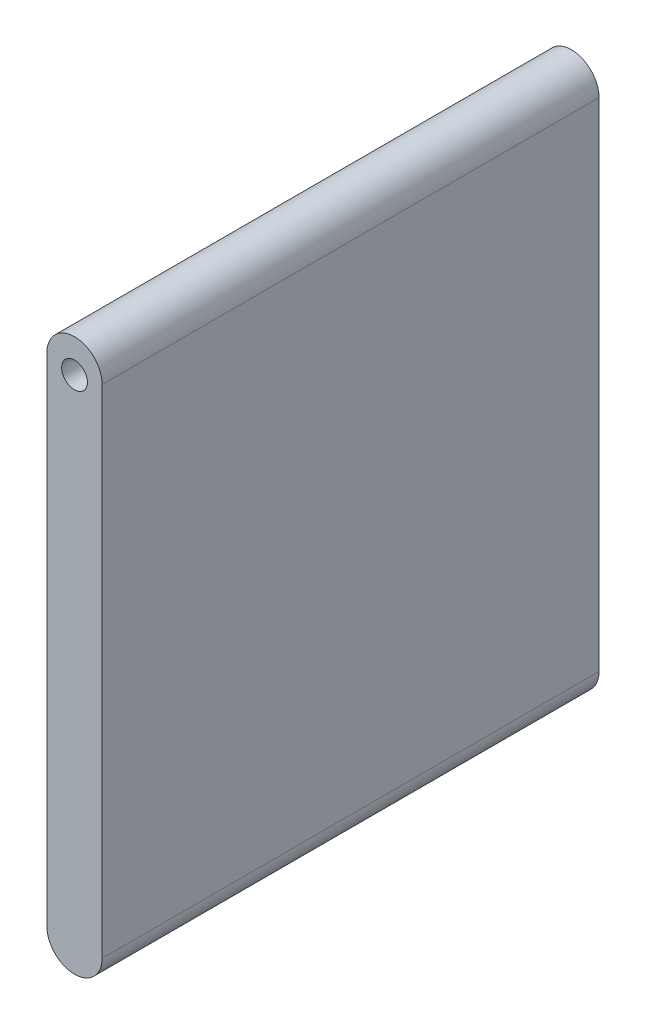
ISO-10303-21;
HEADER;
FILE_DESCRIPTION(('STEP AP214'),'2;1');
FILE_NAME('part.step','',(''),(''),'','','');
FILE_SCHEMA(('AUTOMOTIVE_DESIGN { 1 0 10303 214 1 1 1 1 }'));
ENDSEC;
DATA;
#1=APPLICATION_CONTEXT('core data for automotive mechanical design processes');
#2=APPLICATION_PROTOCOL_DEFINITION('international standard','automotive_design',2000,#1);
#3=PRODUCT_CONTEXT('',#1,'mechanical');
#4=PRODUCT('Part','Part','',(#3));
#5=PRODUCT_RELATED_PRODUCT_CATEGORY('part','',(#4));
#6=PRODUCT_DEFINITION_FORMATION('','',#4);
#7=PRODUCT_DEFINITION_CONTEXT('part definition',#1,'design');
#8=PRODUCT_DEFINITION('design','',#6,#7);
#9=PRODUCT_DEFINITION_SHAPE('','',#8);
#10=(LENGTH_UNIT() NAMED_UNIT(*) SI_UNIT(.MILLI.,.METRE.));
#11=(NAMED_UNIT(*) PLANE_ANGLE_UNIT() SI_UNIT($,.RADIAN.));
#12=(NAMED_UNIT(*) SI_UNIT($,.STERADIAN.) SOLID_ANGLE_UNIT());
#13=UNCERTAINTY_MEASURE_WITH_UNIT(LENGTH_MEASURE(1.E-05),#10,'distance_accuracy_value','');
#14=(GEOMETRIC_REPRESENTATION_CONTEXT(3) GLOBAL_UNCERTAINTY_ASSIGNED_CONTEXT((#13)) GLOBAL_UNIT_ASSIGNED_CONTEXT((#10,
#11,#12)) REPRESENTATION_CONTEXT('',''));
#15=CARTESIAN_POINT('',(0.,0.,0.));
#16=DIRECTION('',(0.,0.,1.));
#17=DIRECTION('',(1.,0.,0.));
#18=AXIS2_PLACEMENT_3D('',#15,#16,#17);
#19=CARTESIAN_POINT('',(-4.4030818648567,46.7518362911079,15.));
#20=DIRECTION('',(-1.,0.,0.));
#21=DIRECTION('',(0.,-1.,0.));
#22=AXIS2_PLACEMENT_3D('',#19,#20,#21);
#23=PLANE('',#22);
#24=DIRECTION('',(0.,1.,0.));
#25=VECTOR('',#24,1.);
#26=CARTESIAN_POINT('',(-4.4030818648567,46.7518362911079,125.));
#27=LINE('',#26,#25);
#28=CARTESIAN_POINT('',(-4.40308186485671,-66.2381994450933,125.));
#29=VERTEX_POINT('',#28);
#30=CARTESIAN_POINT('',(-4.4030818648567,46.7518362911079,125.));
#31=VERTEX_POINT('',#30);
#32=EDGE_CURVE('E187',#29,#31,#27,.T.);
#33=ORIENTED_EDGE('',*,*,#32,.F.);
#34=DIRECTION('',(0.,0.,1.));
#35=VECTOR('',#34,1.);
#36=CARTESIAN_POINT('',(-4.40308186485671,-66.2381994450933,15.));
#37=LINE('',#36,#35);
#38=CARTESIAN_POINT('',(-4.40308186485671,-66.2381994450933,40.));
#39=VERTEX_POINT('',#38);
#40=EDGE_CURVE('E175',#39,#29,#37,.T.);
#41=ORIENTED_EDGE('',*,*,#40,.F.);
#42=DIRECTION('',(0.,1.,0.));
#43=VECTOR('',#42,1.);
#44=CARTESIAN_POINT('',(-4.40308186485671,0.,40.));
#45=LINE('',#44,#43);
#46=CARTESIAN_POINT('',(-4.40308186485671,-30.5781994450934,40.));
#47=VERTEX_POINT('',#46);
#48=EDGE_CURVE('E375',#39,#47,#45,.T.);
#49=ORIENTED_EDGE('',*,*,#48,.T.);
#50=DIRECTION('',(0.,0.,1.));
#51=VECTOR('',#50,1.);
#52=CARTESIAN_POINT('',(-4.40308186485671,-30.5781994450934,40.));
#53=LINE('',#52,#51);
#54=CARTESIAN_POINT('',(-4.40308186485672,-30.5781994450934,15.));
#55=VERTEX_POINT('',#54);
#56=EDGE_CURVE('E219',#55,#47,#53,.T.);
#57=ORIENTED_EDGE('',*,*,#56,.F.);
#58=DIRECTION('',(0.,-1.,0.));
#59=VECTOR('',#58,1.);
#60=CARTESIAN_POINT('',(-4.40308186485671,-46.7518362911079,15.));
#61=LINE('',#60,#59);
#62=CARTESIAN_POINT('',(-4.4030818648567,46.7518362911079,15.));
#63=VERTEX_POINT('',#62);
#64=EDGE_CURVE('E191',#63,#55,#61,.T.);
#65=ORIENTED_EDGE('',*,*,#64,.F.);
#66=DIRECTION('',(0.,0.,1.));
#67=VECTOR('',#66,1.);
#68=CARTESIAN_POINT('',(-4.4030818648567,46.7518362911079,15.));
#69=LINE('',#68,#67);
#70=EDGE_CURVE('E188',#63,#31,#69,.T.);
#71=ORIENTED_EDGE('',*,*,#70,.T.);
#72=EDGE_LOOP('',(#33,#41,#49,#57,#65,#71));
#73=FACE_BOUND('',#72,.T.);
#74=ADVANCED_FACE('F47',(#73),#23,.F.);
#75=CARTESIAN_POINT('',(4.4030818648567,46.7518362911079,15.));
#76=DIRECTION('',(1.,0.,0.));
#77=DIRECTION('',(0.,1.,0.));
#78=AXIS2_PLACEMENT_3D('',#75,#76,#77);
#79=PLANE('',#78);
#80=DIRECTION('',(0.,-1.,0.));
#81=VECTOR('',#80,1.);
#82=CARTESIAN_POINT('',(4.4030818648567,46.7518362911079,125.));
#83=LINE('',#82,#81);
#84=CARTESIAN_POINT('',(4.4030818648567,46.7518362911079,125.));
#85=VERTEX_POINT('',#84);
#86=CARTESIAN_POINT('',(4.40308186485671,-66.2381994450933,125.));
#87=VERTEX_POINT('',#86);
#88=EDGE_CURVE('E63',#85,#87,#83,.T.);
#89=ORIENTED_EDGE('',*,*,#88,.F.);
#90=DIRECTION('',(0.,0.,1.));
#91=VECTOR('',#90,1.);
#92=CARTESIAN_POINT('',(4.4030818648567,46.7518362911079,15.));
#93=LINE('',#92,#91);
#94=CARTESIAN_POINT('',(4.4030818648567,46.7518362911079,15.));
#95=VERTEX_POINT('',#94);
#96=EDGE_CURVE('E211',#95,#85,#93,.T.);
#97=ORIENTED_EDGE('',*,*,#96,.F.);
#98=DIRECTION('',(0.,1.,0.));
#99=VECTOR('',#98,1.);
#100=CARTESIAN_POINT('',(4.40308186485671,-46.7518362911079,15.));
#101=LINE('',#100,#99);
#102=CARTESIAN_POINT('',(4.40308186485672,-30.5781994450934,15.));
#103=VERTEX_POINT('',#102);
#104=EDGE_CURVE('E202',#103,#95,#101,.T.);
#105=ORIENTED_EDGE('',*,*,#104,.F.);
#106=DIRECTION('',(0.,0.,-1.));
#107=VECTOR('',#106,1.);
#108=CARTESIAN_POINT('',(4.40308186485671,-30.5781994450934,40.));
#109=LINE('',#108,#107);
#110=CARTESIAN_POINT('',(4.40308186485671,-30.5781994450934,40.));
#111=VERTEX_POINT('',#110);
#112=EDGE_CURVE('E210',#111,#103,#109,.T.);
#113=ORIENTED_EDGE('',*,*,#112,.F.);
#114=DIRECTION('',(0.,-1.,0.));
#115=VECTOR('',#114,1.);
#116=CARTESIAN_POINT('',(4.40308186485671,0.,40.));
#117=LINE('',#116,#115);
#118=CARTESIAN_POINT('',(4.40308186485671,-66.2381994450933,40.));
#119=VERTEX_POINT('',#118);
#120=EDGE_CURVE('E371',#111,#119,#117,.T.);
#121=ORIENTED_EDGE('',*,*,#120,.T.);
#122=DIRECTION('',(0.,0.,1.));
#123=VECTOR('',#122,1.);
#124=CARTESIAN_POINT('',(4.40308186485671,-66.2381994450933,15.));
#125=LINE('',#124,#123);
#126=EDGE_CURVE('E183',#119,#87,#125,.T.);
#127=ORIENTED_EDGE('',*,*,#126,.T.);
#128=EDGE_LOOP('',(#89,#97,#105,#113,#121,#127));
#129=FACE_BOUND('',#128,.T.);
#130=ADVANCED_FACE('F383',(#129),#79,.F.);
#131=CARTESIAN_POINT('',(4.4030818648567,46.7518362911079,15.));
#132=DIRECTION('',(0.,1.,0.));
#133=DIRECTION('',(0.,0.,1.));
#134=AXIS2_PLACEMENT_3D('',#131,#132,#133);
#135=PLANE('',#134);
#136=DIRECTION('',(1.,0.,0.));
#137=VECTOR('',#136,1.);
#138=CARTESIAN_POINT('',(-4.5969181351433,46.7518362911079,125.));
#139=LINE('',#138,#137);
#140=EDGE_CURVE('E70',#31,#85,#139,.T.);
#141=ORIENTED_EDGE('',*,*,#140,.F.);
#142=ORIENTED_EDGE('',*,*,#70,.F.);
#143=DIRECTION('',(-1.,0.,0.));
#144=VECTOR('',#143,1.);
#145=CARTESIAN_POINT('',(4.4030818648567,46.7518362911079,15.));
#146=LINE('',#145,#144);
#147=EDGE_CURVE('E184',#95,#63,#146,.T.);
#148=ORIENTED_EDGE('',*,*,#147,.F.);
#149=ORIENTED_EDGE('',*,*,#96,.T.);
#150=EDGE_LOOP('',(#141,#142,#148,#149));
#151=FACE_BOUND('',#150,.T.);
#152=ADVANCED_FACE('F426',(#151),#135,.F.);
#153=CARTESIAN_POINT('',(-4.40308186485671,-66.2381994450933,15.));
#154=DIRECTION('',(0.,-1.,0.));
#155=DIRECTION('',(0.,0.,-1.));
#156=AXIS2_PLACEMENT_3D('',#153,#154,#155);
#157=PLANE('',#156);
#158=DIRECTION('',(-1.,0.,0.));
#159=VECTOR('',#158,1.);
#160=CARTESIAN_POINT('',(-4.40308186485671,-66.2381994450933,125.));
#161=LINE('',#160,#159);
#162=EDGE_CURVE('E11',#87,#29,#161,.T.);
#163=ORIENTED_EDGE('',*,*,#162,.F.);
#164=ORIENTED_EDGE('',*,*,#126,.F.);
#165=DIRECTION('',(-1.,0.,0.));
#166=VECTOR('',#165,1.);
#167=CARTESIAN_POINT('',(0.,-66.2381994450933,40.));
#168=LINE('',#167,#166);
#169=EDGE_CURVE('E179',#119,#39,#168,.T.);
#170=ORIENTED_EDGE('',*,*,#169,.T.);
#171=ORIENTED_EDGE('',*,*,#40,.T.);
#172=EDGE_LOOP('',(#163,#164,#170,#171));
#173=FACE_BOUND('',#172,.T.);
#174=ADVANCED_FACE('F177',(#173),#157,.F.);
#175=CARTESIAN_POINT('',(-7.40308186485673,56.2618005549066,135.));
#176=DIRECTION('',(1.,0.,0.));
#177=DIRECTION('',(0.,1.,0.));
#178=AXIS2_PLACEMENT_3D('',#175,#176,#177);
#179=PLANE('',#178);
#180=DIRECTION('',(0.,0.,1.));
#181=VECTOR('',#180,1.);
#182=CARTESIAN_POINT('',(-7.40308186485672,-57.9681292597429,95.));
#183=LINE('',#182,#181);
#184=CARTESIAN_POINT('',(-7.40308186485672,-57.9681292597429,40.));
#185=VERTEX_POINT('',#184);
#186=CARTESIAN_POINT('',(-7.40308186485672,-57.9681292597429,95.));
#187=VERTEX_POINT('',#186);
#188=EDGE_CURVE('E263',#185,#187,#183,.T.);
#189=ORIENTED_EDGE('',*,*,#188,.F.);
#190=DIRECTION('',(0.,-1.,0.));
#191=VECTOR('',#190,1.);
#192=CARTESIAN_POINT('',(-7.40308186485672,-57.9681292597429,40.));
#193=LINE('',#192,#191);
#194=CARTESIAN_POINT('',(-7.40308186485672,-41.5329864320166,40.));
#195=VERTEX_POINT('',#194);
#196=EDGE_CURVE('E260',#195,#185,#193,.T.);
#197=ORIENTED_EDGE('',*,*,#196,.F.);
#198=DIRECTION('',(0.,0.,-1.));
#199=VECTOR('',#198,1.);
#200=CARTESIAN_POINT('',(-7.40308186485672,-41.5329864320166,95.));
#201=LINE('',#200,#199);
#202=CARTESIAN_POINT('',(-7.40308186485672,-41.5329864320166,95.));
#203=VERTEX_POINT('',#202);
#204=EDGE_CURVE('E270',#203,#195,#201,.T.);
#205=ORIENTED_EDGE('',*,*,#204,.F.);
#206=DIRECTION('',(0.,1.,0.));
#207=VECTOR('',#206,1.);
#208=CARTESIAN_POINT('',(-7.40308186485672,-57.9681292597429,95.));
#209=LINE('',#208,#207);
#210=EDGE_CURVE('E267',#187,#203,#209,.T.);
#211=ORIENTED_EDGE('',*,*,#210,.F.);
#212=EDGE_LOOP('',(#189,#197,#205,#211));
#213=FACE_BOUND('',#212,.T.);
#214=DIRECTION('',(0.,-1.,0.));
#215=VECTOR('',#214,1.);
#216=CARTESIAN_POINT('',(-7.40308186485673,56.2618005549066,0.));
#217=LINE('',#216,#215);
#218=CARTESIAN_POINT('',(-7.40308186485673,56.2618005549066,0.));
#219=VERTEX_POINT('',#218);
#220=CARTESIAN_POINT('',(-7.40308186485672,-78.7381994450934,0.));
#221=VERTEX_POINT('',#220);
#222=EDGE_CURVE('E346',#219,#221,#217,.T.);
#223=ORIENTED_EDGE('',*,*,#222,.T.);
#224=DIRECTION('',(0.,0.,-1.));
#225=VECTOR('',#224,1.);
#226=CARTESIAN_POINT('',(-7.40308186485672,-78.7381994450934,135.));
#227=LINE('',#226,#225);
#228=CARTESIAN_POINT('',(-7.40308186485672,-78.7381994450934,135.));
#229=VERTEX_POINT('',#228);
#230=EDGE_CURVE('E361',#229,#221,#227,.T.);
#231=ORIENTED_EDGE('',*,*,#230,.F.);
#232=DIRECTION('',(0.,-1.,0.));
#233=VECTOR('',#232,1.);
#234=CARTESIAN_POINT('',(-7.40308186485673,56.2618005549066,135.));
#235=LINE('',#234,#233);
#236=CARTESIAN_POINT('',(-7.40308186485673,56.2618005549066,135.));
#237=VERTEX_POINT('',#236);
#238=EDGE_CURVE('E332',#237,#229,#235,.T.);
#239=ORIENTED_EDGE('',*,*,#238,.F.);
#240=DIRECTION('',(0.,0.,-1.));
#241=VECTOR('',#240,1.);
#242=CARTESIAN_POINT('',(-7.40308186485673,56.2618005549066,135.));
#243=LINE('',#242,#241);
#244=EDGE_CURVE('E365',#237,#219,#243,.T.);
#245=ORIENTED_EDGE('',*,*,#244,.T.);
#246=EDGE_LOOP('',(#223,#231,#239,#245));
#247=FACE_BOUND('',#246,.T.);
#248=ADVANCED_FACE('F435',(#213,#247),#179,.F.);
#249=CARTESIAN_POINT('',(0.0969181351432745,56.2618005549066,135.));
#250=DIRECTION('',(0.,0.,-1.));
#251=DIRECTION('',(-1.,0.,0.));
#252=AXIS2_PLACEMENT_3D('',#249,#250,#251);
#253=CYLINDRICAL_SURFACE('',#252,7.5);
#254=CARTESIAN_POINT('',(0.0969181351432745,56.2618005549066,0.));
#255=DIRECTION('',(0.,0.,1.));
#256=DIRECTION('',(1.,0.,0.));
#257=AXIS2_PLACEMENT_3D('',#254,#255,#256);
#258=CIRCLE('',#257,7.5);
#259=CARTESIAN_POINT('',(7.59691813514327,56.2618005549066,0.));
#260=VERTEX_POINT('',#259);
#261=EDGE_CURVE('E324',#260,#219,#258,.T.);
#262=ORIENTED_EDGE('',*,*,#261,.T.);
#263=ORIENTED_EDGE('',*,*,#244,.F.);
#264=CARTESIAN_POINT('',(0.0969181351432745,56.2618005549066,135.));
#265=DIRECTION('',(0.,0.,1.));
#266=DIRECTION('',(1.,0.,0.));
#267=AXIS2_PLACEMENT_3D('',#264,#265,#266);
#268=CIRCLE('',#267,7.5);
#269=CARTESIAN_POINT('',(7.59691813514327,56.2618005549066,135.));
#270=VERTEX_POINT('',#269);
#271=EDGE_CURVE('E328',#270,#237,#268,.T.);
#272=ORIENTED_EDGE('',*,*,#271,.F.);
#273=DIRECTION('',(0.,0.,-1.));
#274=VECTOR('',#273,1.);
#275=CARTESIAN_POINT('',(7.59691813514327,56.2618005549066,135.));
#276=LINE('',#275,#274);
#277=EDGE_CURVE('E342',#270,#260,#276,.T.);
#278=ORIENTED_EDGE('',*,*,#277,.T.);
#279=EDGE_LOOP('',(#262,#263,#272,#278));
#280=FACE_BOUND('',#279,.T.);
#281=ADVANCED_FACE('F49',(#280),#253,.T.);
#282=CARTESIAN_POINT('',(0.0969181351432745,-78.7381994450934,135.));
#283=DIRECTION('',(0.,0.,-1.));
#284=DIRECTION('',(-1.,0.,0.));
#285=AXIS2_PLACEMENT_3D('',#282,#283,#284);
#286=CYLINDRICAL_SURFACE('',#285,7.5);
#287=CARTESIAN_POINT('',(0.0969181351432745,-78.7381994450934,0.));
#288=DIRECTION('',(0.,0.,1.));
#289=DIRECTION('',(-1.,0.,0.));
#290=AXIS2_PLACEMENT_3D('',#287,#288,#289);
#291=CIRCLE('',#290,7.5);
#292=CARTESIAN_POINT('',(7.59691813514327,-78.7381994450934,0.));
#293=VERTEX_POINT('',#292);
#294=EDGE_CURVE('E349',#221,#293,#291,.T.);
#295=ORIENTED_EDGE('',*,*,#294,.T.);
#296=DIRECTION('',(0.,0.,-1.));
#297=VECTOR('',#296,1.);
#298=CARTESIAN_POINT('',(7.59691813514327,-78.7381994450934,135.));
#299=LINE('',#298,#297);
#300=CARTESIAN_POINT('',(7.59691813514327,-78.7381994450934,135.));
#301=VERTEX_POINT('',#300);
#302=EDGE_CURVE('E357',#301,#293,#299,.T.);
#303=ORIENTED_EDGE('',*,*,#302,.F.);
#304=CARTESIAN_POINT('',(0.0969181351432745,-78.7381994450934,135.));
#305=DIRECTION('',(0.,0.,1.));
#306=DIRECTION('',(-1.,0.,0.));
#307=AXIS2_PLACEMENT_3D('',#304,#305,#306);
#308=CIRCLE('',#307,7.5);
#309=EDGE_CURVE('E336',#229,#301,#308,.T.);
#310=ORIENTED_EDGE('',*,*,#309,.F.);
#311=ORIENTED_EDGE('',*,*,#230,.T.);
#312=EDGE_LOOP('',(#295,#303,#310,#311));
#313=FACE_BOUND('',#312,.T.);
#314=ADVANCED_FACE('F487',(#313),#286,.T.);
#315=CARTESIAN_POINT('',(7.59691813514327,56.2618005549066,135.));
#316=DIRECTION('',(-1.,0.,0.));
#317=DIRECTION('',(0.,-1.,0.));
#318=AXIS2_PLACEMENT_3D('',#315,#316,#317);
#319=PLANE('',#318);
#320=DIRECTION('',(0.,1.,0.));
#321=VECTOR('',#320,1.);
#322=CARTESIAN_POINT('',(7.59691813514327,56.2618005549066,0.));
#323=LINE('',#322,#321);
#324=EDGE_CURVE('E333',#293,#260,#323,.T.);
#325=ORIENTED_EDGE('',*,*,#324,.T.);
#326=ORIENTED_EDGE('',*,*,#277,.F.);
#327=DIRECTION('',(0.,1.,0.));
#328=VECTOR('',#327,1.);
#329=CARTESIAN_POINT('',(7.59691813514327,56.2618005549066,135.));
#330=LINE('',#329,#328);
#331=EDGE_CURVE('E339',#301,#270,#330,.T.);
#332=ORIENTED_EDGE('',*,*,#331,.F.);
#333=ORIENTED_EDGE('',*,*,#302,.T.);
#334=EDGE_LOOP('',(#325,#326,#332,#333));
#335=FACE_BOUND('',#334,.T.);
#336=ADVANCED_FACE('F482',(#335),#319,.F.);
#337=CARTESIAN_POINT('',(0.0969181351432745,56.2618005549066,135.));
#338=DIRECTION('',(0.,0.,1.));
#339=DIRECTION('',(1.,0.,0.));
#340=AXIS2_PLACEMENT_3D('',#337,#338,#339);
#341=PLANE('',#340);
#342=CARTESIAN_POINT('',(0.0969181351432748,54.7618005549066,135.));
#343=DIRECTION('',(0.,0.,1.));
#344=DIRECTION('',(1.,0.,0.));
#345=AXIS2_PLACEMENT_3D('',#342,#343,#344);
#346=CIRCLE('',#345,3.5);
#347=CARTESIAN_POINT('',(3.59691813514328,54.7618005549066,135.));
#348=VERTEX_POINT('',#347);
#349=EDGE_CURVE('E223',#348,#348,#346,.T.);
#350=ORIENTED_EDGE('',*,*,#349,.F.);
#351=EDGE_LOOP('',(#350));
#352=FACE_BOUND('',#351,.T.);
#353=ORIENTED_EDGE('',*,*,#271,.T.);
#354=ORIENTED_EDGE('',*,*,#238,.T.);
#355=ORIENTED_EDGE('',*,*,#309,.T.);
#356=ORIENTED_EDGE('',*,*,#331,.T.);
#357=EDGE_LOOP('',(#353,#354,#355,#356));
#358=FACE_BOUND('',#357,.T.);
#359=ADVANCED_FACE('F479',(#352,#358),#341,.T.);
#360=CARTESIAN_POINT('',(0.0969181351432745,56.2618005549066,0.));
#361=DIRECTION('',(0.,0.,1.));
#362=DIRECTION('',(1.,0.,0.));
#363=AXIS2_PLACEMENT_3D('',#360,#361,#362);
#364=PLANE('',#363);
#365=DIRECTION('',(-1.,0.,0.));
#366=VECTOR('',#365,1.);
#367=CARTESIAN_POINT('',(5.59691813514327,-66.5781994450934,0.));
#368=LINE('',#367,#366);
#369=CARTESIAN_POINT('',(5.59691813514327,-66.5781994450934,0.));
#370=VERTEX_POINT('',#369);
#371=CARTESIAN_POINT('',(-5.40308186485673,-66.5781994450934,0.));
#372=VERTEX_POINT('',#371);
#373=EDGE_CURVE('E296',#370,#372,#368,.T.);
#374=ORIENTED_EDGE('',*,*,#373,.F.);
#375=DIRECTION('',(0.,-1.,0.));
#376=VECTOR('',#375,1.);
#377=CARTESIAN_POINT('',(5.59691813514327,-66.5781994450934,0.));
#378=LINE('',#377,#376);
#379=CARTESIAN_POINT('',(5.59691813514327,-30.5781994450934,0.));
#380=VERTEX_POINT('',#379);
#381=EDGE_CURVE('E274',#380,#370,#378,.T.);
#382=ORIENTED_EDGE('',*,*,#381,.F.);
#383=DIRECTION('',(1.,0.,0.));
#384=VECTOR('',#383,1.);
#385=CARTESIAN_POINT('',(-5.40308186485673,-30.5781994450934,0.));
#386=LINE('',#385,#384);
#387=CARTESIAN_POINT('',(-5.40308186485673,-30.5781994450934,0.));
#388=VERTEX_POINT('',#387);
#389=EDGE_CURVE('E280',#388,#380,#386,.T.);
#390=ORIENTED_EDGE('',*,*,#389,.F.);
#391=DIRECTION('',(0.,1.,0.));
#392=VECTOR('',#391,1.);
#393=CARTESIAN_POINT('',(-5.40308186485673,-66.5781994450934,0.));
#394=LINE('',#393,#392);
#395=EDGE_CURVE('E300',#372,#388,#394,.T.);
#396=ORIENTED_EDGE('',*,*,#395,.F.);
#397=EDGE_LOOP('',(#374,#382,#390,#396));
#398=FACE_BOUND('',#397,.T.);
#399=CARTESIAN_POINT('',(0.0969181351432743,54.7618005549066,0.));
#400=DIRECTION('',(0.,0.,-1.));
#401=DIRECTION('',(-1.,0.,0.));
#402=AXIS2_PLACEMENT_3D('',#399,#400,#401);
#403=CIRCLE('',#402,3.25);
#404=CARTESIAN_POINT('',(-3.15308186485673,54.7618005549066,0.));
#405=VERTEX_POINT('',#404);
#406=EDGE_CURVE('E310',#405,#405,#403,.T.);
#407=ORIENTED_EDGE('',*,*,#406,.F.);
#408=EDGE_LOOP('',(#407));
#409=FACE_BOUND('',#408,.T.);
#410=ORIENTED_EDGE('',*,*,#261,.F.);
#411=ORIENTED_EDGE('',*,*,#324,.F.);
#412=ORIENTED_EDGE('',*,*,#294,.F.);
#413=ORIENTED_EDGE('',*,*,#222,.F.);
#414=EDGE_LOOP('',(#410,#411,#412,#413));
#415=FACE_BOUND('',#414,.T.);
#416=ADVANCED_FACE('F402',(#398,#409,#415),#364,.F.);
#417=CARTESIAN_POINT('',(0.0969181351432743,54.7618005549066,10.));
#418=DIRECTION('',(0.,0.,-1.));
#419=DIRECTION('',(-1.,0.,0.));
#420=AXIS2_PLACEMENT_3D('',#417,#418,#419);
#421=CYLINDRICAL_SURFACE('',#420,3.25);
#422=CARTESIAN_POINT('',(0.0969181351432743,54.7618005549066,10.));
#423=DIRECTION('',(0.,0.,-1.));
#424=DIRECTION('',(-1.,0.,0.));
#425=AXIS2_PLACEMENT_3D('',#422,#423,#424);
#426=CIRCLE('',#425,3.25);
#427=CARTESIAN_POINT('',(-3.15308186485673,54.7618005549066,10.));
#428=VERTEX_POINT('',#427);
#429=EDGE_CURVE('E320',#428,#428,#426,.T.);
#430=ORIENTED_EDGE('',*,*,#429,.F.);
#431=EDGE_LOOP('',(#430));
#432=FACE_BOUND('',#431,.T.);
#433=ORIENTED_EDGE('',*,*,#406,.T.);
#434=EDGE_LOOP('',(#433));
#435=FACE_BOUND('',#434,.T.);
#436=ADVANCED_FACE('F472',(#432,#435),#421,.F.);
#437=CARTESIAN_POINT('',(0.0969181351432743,54.7618005549066,10.));
#438=DIRECTION('',(0.,0.,-1.));
#439=DIRECTION('',(-1.,0.,0.));
#440=AXIS2_PLACEMENT_3D('',#437,#438,#439);
#441=PLANE('',#440);
#442=ORIENTED_EDGE('',*,*,#429,.T.);
#443=EDGE_LOOP('',(#442));
#444=FACE_BOUND('',#443,.T.);
#445=ADVANCED_FACE('F467',(#444),#441,.T.);
#446=CARTESIAN_POINT('',(5.59691813514327,-66.5781994450934,40.));
#447=DIRECTION('',(1.,0.,0.));
#448=DIRECTION('',(0.,1.,0.));
#449=AXIS2_PLACEMENT_3D('',#446,#447,#448);
#450=PLANE('',#449);
#451=ORIENTED_EDGE('',*,*,#381,.T.);
#452=DIRECTION('',(0.,0.,-1.));
#453=VECTOR('',#452,1.);
#454=CARTESIAN_POINT('',(5.59691813514327,-66.5781994450934,40.));
#455=LINE('',#454,#453);
#456=CARTESIAN_POINT('',(5.59691813514327,-66.5781994450934,40.));
#457=VERTEX_POINT('',#456);
#458=EDGE_CURVE('E293',#457,#370,#455,.T.);
#459=ORIENTED_EDGE('',*,*,#458,.F.);
#460=DIRECTION('',(0.,-1.,0.));
#461=VECTOR('',#460,1.);
#462=CARTESIAN_POINT('',(5.59691813514327,-66.5781994450934,40.));
#463=LINE('',#462,#461);
#464=CARTESIAN_POINT('',(5.59691813514327,-30.5781994450934,40.));
#465=VERTEX_POINT('',#464);
#466=EDGE_CURVE('E275',#465,#457,#463,.T.);
#467=ORIENTED_EDGE('',*,*,#466,.F.);
#468=DIRECTION('',(0.,0.,-1.));
#469=VECTOR('',#468,1.);
#470=CARTESIAN_POINT('',(5.59691813514327,-30.5781994450934,40.));
#471=LINE('',#470,#469);
#472=EDGE_CURVE('E307',#465,#380,#471,.T.);
#473=ORIENTED_EDGE('',*,*,#472,.T.);
#474=EDGE_LOOP('',(#451,#459,#467,#473));
#475=FACE_BOUND('',#474,.T.);
#476=ADVANCED_FACE('F405',(#475),#450,.F.);
#477=CARTESIAN_POINT('',(-5.40308186485673,-30.5781994450934,40.));
#478=DIRECTION('',(0.,1.,0.));
#479=DIRECTION('',(0.,0.,1.));
#480=AXIS2_PLACEMENT_3D('',#477,#478,#479);
#481=PLANE('',#480);
#482=DIRECTION('',(1.,0.,0.));
#483=VECTOR('',#482,1.);
#484=CARTESIAN_POINT('',(-5.40308186485673,-30.5781994450934,15.));
#485=LINE('',#484,#483);
#486=EDGE_CURVE('E56',#55,#103,#485,.T.);
#487=ORIENTED_EDGE('',*,*,#486,.F.);
#488=ORIENTED_EDGE('',*,*,#56,.T.);
#489=DIRECTION('',(1.,0.,0.));
#490=VECTOR('',#489,1.);
#491=CARTESIAN_POINT('',(-5.40308186485673,-30.5781994450934,40.));
#492=LINE('',#491,#490);
#493=CARTESIAN_POINT('',(-5.40308186485673,-30.5781994450934,40.));
#494=VERTEX_POINT('',#493);
#495=EDGE_CURVE('E289',#494,#47,#492,.T.);
#496=ORIENTED_EDGE('',*,*,#495,.F.);
#497=DIRECTION('',(0.,0.,-1.));
#498=VECTOR('',#497,1.);
#499=CARTESIAN_POINT('',(-5.40308186485673,-30.5781994450934,40.));
#500=LINE('',#499,#498);
#501=EDGE_CURVE('E311',#494,#388,#500,.T.);
#502=ORIENTED_EDGE('',*,*,#501,.T.);
#503=ORIENTED_EDGE('',*,*,#389,.T.);
#504=ORIENTED_EDGE('',*,*,#472,.F.);
#505=EDGE_CURVE('E288',#111,#465,#492,.T.);
#506=ORIENTED_EDGE('',*,*,#505,.F.);
#507=ORIENTED_EDGE('',*,*,#112,.T.);
#508=EDGE_LOOP('',(#487,#488,#496,#502,#503,#504,#506,#507));
#509=FACE_BOUND('',#508,.T.);
#510=ADVANCED_FACE('F387',(#509),#481,.F.);
#511=CARTESIAN_POINT('',(-5.40308186485673,-66.5781994450934,40.));
#512=DIRECTION('',(-1.,0.,0.));
#513=DIRECTION('',(0.,0.,1.));
#514=AXIS2_PLACEMENT_3D('',#511,#512,#513);
#515=PLANE('',#514);
#516=ORIENTED_EDGE('',*,*,#395,.T.);
#517=ORIENTED_EDGE('',*,*,#501,.F.);
#518=DIRECTION('',(0.,1.,0.));
#519=VECTOR('',#518,1.);
#520=CARTESIAN_POINT('',(-5.40308186485673,-66.5781994450934,40.));
#521=LINE('',#520,#519);
#522=CARTESIAN_POINT('',(-5.40308186485673,-66.5781994450934,40.));
#523=VERTEX_POINT('',#522);
#524=EDGE_CURVE('E284',#523,#494,#521,.T.);
#525=ORIENTED_EDGE('',*,*,#524,.F.);
#526=DIRECTION('',(0.,0.,-1.));
#527=VECTOR('',#526,1.);
#528=CARTESIAN_POINT('',(-5.40308186485673,-66.5781994450934,40.));
#529=LINE('',#528,#527);
#530=EDGE_CURVE('E314',#523,#372,#529,.T.);
#531=ORIENTED_EDGE('',*,*,#530,.T.);
#532=EDGE_LOOP('',(#516,#517,#525,#531));
#533=FACE_BOUND('',#532,.T.);
#534=ADVANCED_FACE('F399',(#533),#515,.F.);
#535=CARTESIAN_POINT('',(5.59691813514327,-66.5781994450934,40.));
#536=DIRECTION('',(0.,-1.,0.));
#537=DIRECTION('',(0.,0.,-1.));
#538=AXIS2_PLACEMENT_3D('',#535,#536,#537);
#539=PLANE('',#538);
#540=ORIENTED_EDGE('',*,*,#373,.T.);
#541=ORIENTED_EDGE('',*,*,#530,.F.);
#542=DIRECTION('',(-1.,0.,0.));
#543=VECTOR('',#542,1.);
#544=CARTESIAN_POINT('',(5.59691813514327,-66.5781994450934,40.));
#545=LINE('',#544,#543);
#546=EDGE_CURVE('E279',#457,#523,#545,.T.);
#547=ORIENTED_EDGE('',*,*,#546,.F.);
#548=ORIENTED_EDGE('',*,*,#458,.T.);
#549=EDGE_LOOP('',(#540,#541,#547,#548));
#550=FACE_BOUND('',#549,.T.);
#551=ADVANCED_FACE('F408',(#550),#539,.F.);
#552=CARTESIAN_POINT('',(0.,0.,40.));
#553=DIRECTION('',(0.,0.,-1.));
#554=DIRECTION('',(-1.,0.,0.));
#555=AXIS2_PLACEMENT_3D('',#552,#553,#554);
#556=PLANE('',#555);
#557=ORIENTED_EDGE('',*,*,#48,.F.);
#558=ORIENTED_EDGE('',*,*,#169,.F.);
#559=ORIENTED_EDGE('',*,*,#120,.F.);
#560=ORIENTED_EDGE('',*,*,#505,.T.);
#561=ORIENTED_EDGE('',*,*,#466,.T.);
#562=ORIENTED_EDGE('',*,*,#546,.T.);
#563=ORIENTED_EDGE('',*,*,#524,.T.);
#564=ORIENTED_EDGE('',*,*,#495,.T.);
#565=EDGE_LOOP('',(#557,#558,#559,#560,#561,#562,#563,#564));
#566=FACE_BOUND('',#565,.T.);
#567=ADVANCED_FACE('F392',(#566),#556,.T.);
#568=CARTESIAN_POINT('',(-42.4030818648567,-57.9681292597429,95.));
#569=DIRECTION('',(0.,1.,0.));
#570=DIRECTION('',(-1.,0.,0.));
#571=AXIS2_PLACEMENT_3D('',#568,#569,#570);
#572=PLANE('',#571);
#573=DIRECTION('',(0.,0.,-1.));
#574=VECTOR('',#573,1.);
#575=CARTESIAN_POINT('',(-7.56999613906052,-57.9681292597429,95.));
#576=LINE('',#575,#574);
#577=CARTESIAN_POINT('',(-7.56999613906052,-57.9681292597429,82.9589408568396));
#578=VERTEX_POINT('',#577);
#579=CARTESIAN_POINT('',(-7.56999613906052,-57.9681292597429,52.0410591431603));
#580=VERTEX_POINT('',#579);
#581=EDGE_CURVE('E242',#578,#580,#576,.T.);
#582=ORIENTED_EDGE('',*,*,#581,.T.);
#583=CARTESIAN_POINT('',(-7.56999613906052,-57.9681292597429,67.5));
#584=DIRECTION('',(0.,1.,0.));
#585=DIRECTION('',(-1.,0.,0.));
#586=AXIS2_PLACEMENT_3D('',#583,#584,#585);
#587=CIRCLE('',#586,15.4589408568396);
#588=EDGE_CURVE('E249',#580,#578,#587,.T.);
#589=ORIENTED_EDGE('',*,*,#588,.T.);
#590=EDGE_LOOP('',(#582,#589));
#591=FACE_BOUND('',#590,.T.);
#592=ORIENTED_EDGE('',*,*,#188,.T.);
#593=CARTESIAN_POINT('',(-5.65618131635714,-57.9681292597429,67.5));
#594=DIRECTION('',(0.,1.,0.));
#595=DIRECTION('',(-1.,0.,0.));
#596=AXIS2_PLACEMENT_3D('',#593,#594,#595);
#597=CIRCLE('',#596,27.5554288938922);
#598=EDGE_CURVE('E256',#187,#185,#597,.F.);
#599=ORIENTED_EDGE('',*,*,#598,.T.);
#600=EDGE_LOOP('',(#592,#599));
#601=FACE_BOUND('',#600,.T.);
#602=ADVANCED_FACE('F416',(#591,#601),#572,.F.);
#603=CARTESIAN_POINT('',(-42.4030818648567,-41.5329864320166,95.));
#604=DIRECTION('',(0.,-1.,0.));
#605=DIRECTION('',(0.,0.,-1.));
#606=AXIS2_PLACEMENT_3D('',#603,#604,#605);
#607=PLANE('',#606);
#608=DIRECTION('',(0.,0.,-1.));
#609=VECTOR('',#608,1.);
#610=CARTESIAN_POINT('',(-7.56999613906052,-41.5329864320166,52.0410591431603));
#611=LINE('',#610,#609);
#612=CARTESIAN_POINT('',(-7.56999613906052,-41.5329864320166,82.9589408568396));
#613=VERTEX_POINT('',#612);
#614=CARTESIAN_POINT('',(-7.56999613906052,-41.5329864320166,52.0410591431603));
#615=VERTEX_POINT('',#614);
#616=EDGE_CURVE('E234',#613,#615,#611,.T.);
#617=ORIENTED_EDGE('',*,*,#616,.F.);
#618=CARTESIAN_POINT('',(-7.56999613906052,-41.5329864320166,67.5));
#619=DIRECTION('',(0.,1.,0.));
#620=DIRECTION('',(0.,0.,1.));
#621=AXIS2_PLACEMENT_3D('',#618,#619,#620);
#622=CIRCLE('',#621,15.4589408568396);
#623=EDGE_CURVE('E228',#615,#613,#622,.T.);
#624=ORIENTED_EDGE('',*,*,#623,.F.);
#625=EDGE_LOOP('',(#617,#624));
#626=FACE_BOUND('',#625,.T.);
#627=ORIENTED_EDGE('',*,*,#204,.T.);
#628=CARTESIAN_POINT('',(-5.65618131635714,-41.5329864320166,67.5));
#629=DIRECTION('',(0.,-1.,0.));
#630=DIRECTION('',(0.,0.,1.));
#631=AXIS2_PLACEMENT_3D('',#628,#629,#630);
#632=CIRCLE('',#631,27.5554288938922);
#633=EDGE_CURVE('E253',#203,#195,#632,.T.);
#634=ORIENTED_EDGE('',*,*,#633,.F.);
#635=EDGE_LOOP('',(#627,#634));
#636=FACE_BOUND('',#635,.T.);
#637=ADVANCED_FACE('F455',(#626,#636),#607,.F.);
#638=CARTESIAN_POINT('',(-5.65618131635714,-61.5329864320166,67.5));
#639=DIRECTION('',(0.,1.,0.));
#640=DIRECTION('',(0.,0.,1.));
#641=AXIS2_PLACEMENT_3D('',#638,#639,#640);
#642=CYLINDRICAL_SURFACE('',#641,27.5554288938922);
#643=ORIENTED_EDGE('',*,*,#210,.T.);
#644=ORIENTED_EDGE('',*,*,#633,.T.);
#645=ORIENTED_EDGE('',*,*,#196,.T.);
#646=ORIENTED_EDGE('',*,*,#598,.F.);
#647=EDGE_LOOP('',(#643,#644,#645,#646));
#648=FACE_BOUND('',#647,.T.);
#649=ADVANCED_FACE('F451',(#648),#642,.T.);
#650=CARTESIAN_POINT('',(-7.56999613906052,-61.5329864320166,67.5));
#651=DIRECTION('',(0.,1.,0.));
#652=DIRECTION('',(0.,0.,1.));
#653=AXIS2_PLACEMENT_3D('',#650,#651,#652);
#654=CYLINDRICAL_SURFACE('',#653,15.4589408568396);
#655=DIRECTION('',(0.,1.,0.));
#656=VECTOR('',#655,1.);
#657=CARTESIAN_POINT('',(-7.56999613906052,-61.5329864320166,52.0410591431604));
#658=LINE('',#657,#656);
#659=EDGE_CURVE('E239',#580,#615,#658,.T.);
#660=ORIENTED_EDGE('',*,*,#659,.T.);
#661=ORIENTED_EDGE('',*,*,#623,.T.);
#662=DIRECTION('',(0.,1.,0.));
#663=VECTOR('',#662,1.);
#664=CARTESIAN_POINT('',(-7.56999613906052,-61.5329864320166,82.9589408568396));
#665=LINE('',#664,#663);
#666=EDGE_CURVE('E238',#578,#613,#665,.T.);
#667=ORIENTED_EDGE('',*,*,#666,.F.);
#668=ORIENTED_EDGE('',*,*,#588,.F.);
#669=EDGE_LOOP('',(#660,#661,#667,#668));
#670=FACE_BOUND('',#669,.T.);
#671=ADVANCED_FACE('F447',(#670),#654,.F.);
#672=CARTESIAN_POINT('',(-7.56999613906052,-61.5329864320166,52.0410591431604));
#673=DIRECTION('',(1.,0.,0.));
#674=DIRECTION('',(0.,1.,0.));
#675=AXIS2_PLACEMENT_3D('',#672,#673,#674);
#676=PLANE('',#675);
#677=ORIENTED_EDGE('',*,*,#666,.T.);
#678=ORIENTED_EDGE('',*,*,#616,.T.);
#679=ORIENTED_EDGE('',*,*,#659,.F.);
#680=ORIENTED_EDGE('',*,*,#581,.F.);
#681=EDGE_LOOP('',(#677,#678,#679,#680));
#682=FACE_BOUND('',#681,.T.);
#683=ADVANCED_FACE('F443',(#682),#676,.F.);
#684=CARTESIAN_POINT('',(0.0969181351432748,54.7618005549066,125.));
#685=DIRECTION('',(0.,0.,1.));
#686=DIRECTION('',(1.,0.,0.));
#687=AXIS2_PLACEMENT_3D('',#684,#685,#686);
#688=CYLINDRICAL_SURFACE('',#687,3.5);
#689=CARTESIAN_POINT('',(0.0969181351432748,54.7618005549066,125.));
#690=DIRECTION('',(0.,0.,1.));
#691=DIRECTION('',(1.,0.,0.));
#692=AXIS2_PLACEMENT_3D('',#689,#690,#691);
#693=CIRCLE('',#692,3.5);
#694=CARTESIAN_POINT('',(3.59691813514328,54.7618005549066,125.));
#695=VERTEX_POINT('',#694);
#696=EDGE_CURVE('E224',#695,#695,#693,.T.);
#697=ORIENTED_EDGE('',*,*,#696,.F.);
#698=EDGE_LOOP('',(#697));
#699=FACE_BOUND('',#698,.T.);
#700=ORIENTED_EDGE('',*,*,#349,.T.);
#701=EDGE_LOOP('',(#700));
#702=FACE_BOUND('',#701,.T.);
#703=ADVANCED_FACE('F439',(#699,#702),#688,.F.);
#704=CARTESIAN_POINT('',(0.0969181351432748,54.7618005549066,125.));
#705=DIRECTION('',(0.,0.,1.));
#706=DIRECTION('',(1.,0.,0.));
#707=AXIS2_PLACEMENT_3D('',#704,#705,#706);
#708=PLANE('',#707);
#709=ORIENTED_EDGE('',*,*,#696,.T.);
#710=EDGE_LOOP('',(#709));
#711=FACE_BOUND('',#710,.T.);
#712=ADVANCED_FACE('F436',(#711),#708,.T.);
#713=CARTESIAN_POINT('',(0.,0.,15.));
#714=DIRECTION('',(0.,0.,1.));
#715=DIRECTION('',(1.,0.,0.));
#716=AXIS2_PLACEMENT_3D('',#713,#714,#715);
#717=PLANE('',#716);
#718=ORIENTED_EDGE('',*,*,#486,.T.);
#719=ORIENTED_EDGE('',*,*,#104,.T.);
#720=ORIENTED_EDGE('',*,*,#147,.T.);
#721=ORIENTED_EDGE('',*,*,#64,.T.);
#722=EDGE_LOOP('',(#718,#719,#720,#721));
#723=FACE_BOUND('',#722,.T.);
#724=ADVANCED_FACE('F381',(#723),#717,.T.);
#725=CARTESIAN_POINT('',(-4.5969181351433,46.7518362911079,125.));
#726=DIRECTION('',(0.,0.,1.));
#727=DIRECTION('',(1.,0.,0.));
#728=AXIS2_PLACEMENT_3D('',#725,#726,#727);
#729=PLANE('',#728);
#730=ORIENTED_EDGE('',*,*,#162,.T.);
#731=ORIENTED_EDGE('',*,*,#32,.T.);
#732=ORIENTED_EDGE('',*,*,#140,.T.);
#733=ORIENTED_EDGE('',*,*,#88,.T.);
#734=EDGE_LOOP('',(#730,#731,#732,#733));
#735=FACE_BOUND('',#734,.T.);
#736=ADVANCED_FACE('F193',(#735),#729,.F.);
#737=CLOSED_SHELL('',(#74,#130,#152,#174,#248,#281,#314,#336,#359,#416,#436,#445,#476,#510,#534,
#551,#567,#602,#637,#649,#671,#683,#703,#712,#724,#736));
#738=MANIFOLD_SOLID_BREP('B2',#737);
#739=ADVANCED_BREP_SHAPE_REPRESENTATION('',(#18,#738),#14);
#740=SHAPE_DEFINITION_REPRESENTATION(#9,#739);
ENDSEC;
END-ISO-10303-21;
